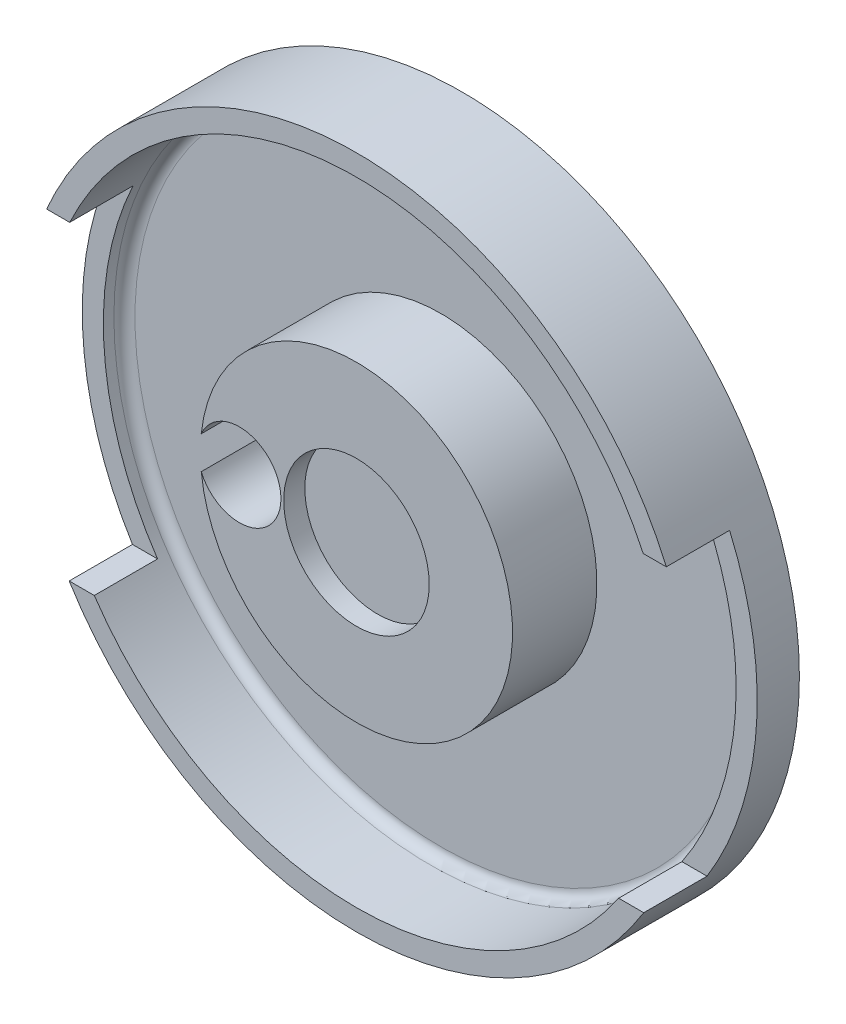
ISO-10303-21;
HEADER;
FILE_DESCRIPTION(('STEP AP214'),'2;1');
FILE_NAME('part.step','',(''),(''),'','','');
FILE_SCHEMA(('AUTOMOTIVE_DESIGN { 1 0 10303 214 1 1 1 1 }'));
ENDSEC;
DATA;
#1=APPLICATION_CONTEXT('core data for automotive mechanical design processes');
#2=APPLICATION_PROTOCOL_DEFINITION('international standard','automotive_design',2000,#1);
#3=PRODUCT_CONTEXT('',#1,'mechanical');
#4=PRODUCT('Part','Part','',(#3));
#5=PRODUCT_RELATED_PRODUCT_CATEGORY('part','',(#4));
#6=PRODUCT_DEFINITION_FORMATION('','',#4);
#7=PRODUCT_DEFINITION_CONTEXT('part definition',#1,'design');
#8=PRODUCT_DEFINITION('design','',#6,#7);
#9=PRODUCT_DEFINITION_SHAPE('','',#8);
#10=(LENGTH_UNIT() NAMED_UNIT(*) SI_UNIT(.MILLI.,.METRE.));
#11=(NAMED_UNIT(*) PLANE_ANGLE_UNIT() SI_UNIT($,.RADIAN.));
#12=(NAMED_UNIT(*) SI_UNIT($,.STERADIAN.) SOLID_ANGLE_UNIT());
#13=UNCERTAINTY_MEASURE_WITH_UNIT(LENGTH_MEASURE(1.E-05),#10,'distance_accuracy_value','');
#14=(GEOMETRIC_REPRESENTATION_CONTEXT(3) GLOBAL_UNCERTAINTY_ASSIGNED_CONTEXT((#13)) GLOBAL_UNIT_ASSIGNED_CONTEXT((#10,
#11,#12)) REPRESENTATION_CONTEXT('',''));
#15=CARTESIAN_POINT('',(0.,0.,0.));
#16=DIRECTION('',(0.,0.,1.));
#17=DIRECTION('',(1.,0.,0.));
#18=AXIS2_PLACEMENT_3D('',#15,#16,#17);
#19=CARTESIAN_POINT('',(0.,0.,5.));
#20=DIRECTION('',(0.,0.,1.));
#21=DIRECTION('',(1.,0.,0.));
#22=AXIS2_PLACEMENT_3D('',#19,#20,#21);
#23=PLANE('',#22);
#24=CARTESIAN_POINT('',(0.,0.,5.));
#25=DIRECTION('',(0.,0.,1.));
#26=DIRECTION('',(1.,0.,0.));
#27=AXIS2_PLACEMENT_3D('',#24,#25,#26);
#28=CIRCLE('',#27,16.);
#29=CARTESIAN_POINT('',(-13.6201960323075,-8.39584778575195,5.));
#30=VERTEX_POINT('',#29);
#31=CARTESIAN_POINT('',(13.6201960323075,-8.39584778575195,5.));
#32=VERTEX_POINT('',#31);
#33=EDGE_CURVE('E177',#30,#32,#28,.T.);
#34=ORIENTED_EDGE('',*,*,#33,.T.);
#35=DIRECTION('',(-1.,0.,0.));
#36=VECTOR('',#35,1.);
#37=CARTESIAN_POINT('',(0.,-8.39584778575195,5.));
#38=LINE('',#37,#36);
#39=CARTESIAN_POINT('',(12.4301946870708,-8.39584778575195,5.));
#40=VERTEX_POINT('',#39);
#41=EDGE_CURVE('E146',#32,#40,#38,.T.);
#42=ORIENTED_EDGE('',*,*,#41,.T.);
#43=CARTESIAN_POINT('',(0.,0.,5.));
#44=DIRECTION('',(0.,0.,1.));
#45=DIRECTION('',(1.,0.,0.));
#46=AXIS2_PLACEMENT_3D('',#43,#44,#45);
#47=CIRCLE('',#46,15.);
#48=CARTESIAN_POINT('',(-12.4301946870708,-8.39584778575195,5.));
#49=VERTEX_POINT('',#48);
#50=EDGE_CURVE('E174',#49,#40,#47,.T.);
#51=ORIENTED_EDGE('',*,*,#50,.F.);
#52=DIRECTION('',(1.,0.,0.));
#53=VECTOR('',#52,1.);
#54=CARTESIAN_POINT('',(0.,-8.39584778575195,5.));
#55=LINE('',#54,#53);
#56=EDGE_CURVE('E165',#30,#49,#55,.T.);
#57=ORIENTED_EDGE('',*,*,#56,.F.);
#58=EDGE_LOOP('',(#34,#42,#51,#57));
#59=FACE_BOUND('',#58,.T.);
#60=ADVANCED_FACE('F39',(#59),#23,.T.);
#61=CARTESIAN_POINT('',(0.,0.,5.));
#62=DIRECTION('',(0.,0.,-1.));
#63=DIRECTION('',(-1.,0.,0.));
#64=AXIS2_PLACEMENT_3D('',#61,#62,#63);
#65=CYLINDRICAL_SURFACE('',#64,16.);
#66=CARTESIAN_POINT('',(0.,0.,0.));
#67=DIRECTION('',(0.,0.,1.));
#68=DIRECTION('',(1.,0.,0.));
#69=AXIS2_PLACEMENT_3D('',#66,#67,#68);
#70=CIRCLE('',#69,16.);
#71=CARTESIAN_POINT('',(16.,0.,0.));
#72=VERTEX_POINT('',#71);
#73=EDGE_CURVE('E178',#72,#72,#70,.T.);
#74=ORIENTED_EDGE('',*,*,#73,.T.);
#75=EDGE_LOOP('',(#74));
#76=FACE_BOUND('',#75,.T.);
#77=CARTESIAN_POINT('',(14.6905696553376,6.33933460243845,5.));
#78=VERTEX_POINT('',#77);
#79=CARTESIAN_POINT('',(-14.6905696553376,6.33933460243845,5.));
#80=VERTEX_POINT('',#79);
#81=EDGE_CURVE('E182',#78,#80,#28,.T.);
#82=ORIENTED_EDGE('',*,*,#81,.F.);
#83=DIRECTION('',(0.,0.,-1.));
#84=VECTOR('',#83,1.);
#85=CARTESIAN_POINT('',(14.6905696553376,6.33933460243845,5.));
#86=LINE('',#85,#84);
#87=CARTESIAN_POINT('',(14.6905696553376,6.33933460243845,2.));
#88=VERTEX_POINT('',#87);
#89=EDGE_CURVE('E152',#78,#88,#86,.T.);
#90=ORIENTED_EDGE('',*,*,#89,.T.);
#91=CARTESIAN_POINT('',(0.,0.,2.));
#92=DIRECTION('',(0.,0.,-1.));
#93=DIRECTION('',(-1.,0.,0.));
#94=AXIS2_PLACEMENT_3D('',#91,#92,#93);
#95=CIRCLE('',#94,16.);
#96=CARTESIAN_POINT('',(13.6201960323075,-8.39584778575195,2.));
#97=VERTEX_POINT('',#96);
#98=EDGE_CURVE('E141',#88,#97,#95,.T.);
#99=ORIENTED_EDGE('',*,*,#98,.T.);
#100=DIRECTION('',(0.,0.,-1.));
#101=VECTOR('',#100,1.);
#102=CARTESIAN_POINT('',(13.6201960323075,-8.39584778575195,5.));
#103=LINE('',#102,#101);
#104=EDGE_CURVE('E148',#32,#97,#103,.T.);
#105=ORIENTED_EDGE('',*,*,#104,.F.);
#106=ORIENTED_EDGE('',*,*,#33,.F.);
#107=DIRECTION('',(0.,0.,-1.));
#108=VECTOR('',#107,1.);
#109=CARTESIAN_POINT('',(-13.6201960323075,-8.39584778575195,5.));
#110=LINE('',#109,#108);
#111=CARTESIAN_POINT('',(-13.6201960323075,-8.39584778575195,2.));
#112=VERTEX_POINT('',#111);
#113=EDGE_CURVE('E168',#30,#112,#110,.T.);
#114=ORIENTED_EDGE('',*,*,#113,.T.);
#115=CARTESIAN_POINT('',(0.,0.,2.));
#116=DIRECTION('',(0.,0.,-1.));
#117=DIRECTION('',(-1.,0.,0.));
#118=AXIS2_PLACEMENT_3D('',#115,#116,#117);
#119=CIRCLE('',#118,16.);
#120=CARTESIAN_POINT('',(-14.6905696553376,6.33933460243845,2.));
#121=VERTEX_POINT('',#120);
#122=EDGE_CURVE('E163',#112,#121,#119,.T.);
#123=ORIENTED_EDGE('',*,*,#122,.T.);
#124=DIRECTION('',(0.,0.,-1.));
#125=VECTOR('',#124,1.);
#126=CARTESIAN_POINT('',(-14.6905696553376,6.33933460243845,5.));
#127=LINE('',#126,#125);
#128=EDGE_CURVE('E175',#80,#121,#127,.T.);
#129=ORIENTED_EDGE('',*,*,#128,.F.);
#130=EDGE_LOOP('',(#82,#90,#99,#105,#106,#114,#123,#129));
#131=FACE_BOUND('',#130,.T.);
#132=ADVANCED_FACE('F224',(#76,#131),#65,.T.);
#133=DIRECTION('',(-1.,0.,0.));
#134=VECTOR('',#133,1.);
#135=CARTESIAN_POINT('',(0.,6.33933460243845,5.));
#136=LINE('',#135,#134);
#137=CARTESIAN_POINT('',(13.5945885115485,6.33933460243845,5.));
#138=VERTEX_POINT('',#137);
#139=EDGE_CURVE('E151',#78,#138,#136,.T.);
#140=ORIENTED_EDGE('',*,*,#139,.F.);
#141=ORIENTED_EDGE('',*,*,#81,.T.);
#142=DIRECTION('',(1.,0.,0.));
#143=VECTOR('',#142,1.);
#144=CARTESIAN_POINT('',(0.,6.33933460243845,5.));
#145=LINE('',#144,#143);
#146=CARTESIAN_POINT('',(-13.5945885115485,6.33933460243845,5.));
#147=VERTEX_POINT('',#146);
#148=EDGE_CURVE('E169',#80,#147,#145,.T.);
#149=ORIENTED_EDGE('',*,*,#148,.T.);
#150=EDGE_CURVE('E172',#138,#147,#47,.T.);
#151=ORIENTED_EDGE('',*,*,#150,.F.);
#152=EDGE_LOOP('',(#140,#141,#149,#151));
#153=FACE_BOUND('',#152,.T.);
#154=ADVANCED_FACE('F213',(#153),#23,.T.);
#155=CARTESIAN_POINT('',(0.,0.,1.));
#156=DIRECTION('',(0.,0.,1.));
#157=DIRECTION('',(1.,0.,0.));
#158=AXIS2_PLACEMENT_3D('',#155,#156,#157);
#159=CYLINDRICAL_SURFACE('',#158,15.);
#160=CARTESIAN_POINT('',(0.,0.,2.));
#161=DIRECTION('',(0.,0.,-1.));
#162=DIRECTION('',(-1.,0.,0.));
#163=AXIS2_PLACEMENT_3D('',#160,#161,#162);
#164=CIRCLE('',#163,15.);
#165=CARTESIAN_POINT('',(12.4301946870708,-8.39584778575195,2.));
#166=VERTEX_POINT('',#165);
#167=CARTESIAN_POINT('',(13.5945885115485,6.33933460243845,2.));
#168=VERTEX_POINT('',#167);
#169=EDGE_CURVE('E199',#166,#168,#164,.F.);
#170=ORIENTED_EDGE('',*,*,#169,.T.);
#171=DIRECTION('',(0.,0.,1.));
#172=VECTOR('',#171,1.);
#173=CARTESIAN_POINT('',(13.5945885115485,6.33933460243845,1.));
#174=LINE('',#173,#172);
#175=EDGE_CURVE('E43',#168,#138,#174,.T.);
#176=ORIENTED_EDGE('',*,*,#175,.T.);
#177=ORIENTED_EDGE('',*,*,#150,.T.);
#178=DIRECTION('',(0.,0.,1.));
#179=VECTOR('',#178,1.);
#180=CARTESIAN_POINT('',(-13.5945885115485,6.33933460243845,1.));
#181=LINE('',#180,#179);
#182=CARTESIAN_POINT('',(-13.5945885115485,6.33933460243845,2.));
#183=VERTEX_POINT('',#182);
#184=EDGE_CURVE('E200',#183,#147,#181,.T.);
#185=ORIENTED_EDGE('',*,*,#184,.F.);
#186=CARTESIAN_POINT('',(0.,0.,2.));
#187=DIRECTION('',(0.,0.,-1.));
#188=DIRECTION('',(-1.,0.,0.));
#189=AXIS2_PLACEMENT_3D('',#186,#187,#188);
#190=CIRCLE('',#189,15.);
#191=CARTESIAN_POINT('',(-12.4301946870708,-8.39584778575195,2.));
#192=VERTEX_POINT('',#191);
#193=EDGE_CURVE('E191',#183,#192,#190,.F.);
#194=ORIENTED_EDGE('',*,*,#193,.T.);
#195=DIRECTION('',(0.,0.,1.));
#196=VECTOR('',#195,1.);
#197=CARTESIAN_POINT('',(-12.4301946870708,-8.39584778575195,1.));
#198=LINE('',#197,#196);
#199=EDGE_CURVE('E193',#192,#49,#198,.T.);
#200=ORIENTED_EDGE('',*,*,#199,.T.);
#201=ORIENTED_EDGE('',*,*,#50,.T.);
#202=DIRECTION('',(0.,0.,1.));
#203=VECTOR('',#202,1.);
#204=CARTESIAN_POINT('',(12.4301946870708,-8.39584778575195,1.));
#205=LINE('',#204,#203);
#206=EDGE_CURVE('E204',#166,#40,#205,.T.);
#207=ORIENTED_EDGE('',*,*,#206,.F.);
#208=EDGE_LOOP('',(#170,#176,#177,#185,#194,#200,#201,#207));
#209=FACE_BOUND('',#208,.T.);
#210=CARTESIAN_POINT('',(0.,0.,1.5));
#211=DIRECTION('',(0.,0.,1.));
#212=DIRECTION('',(1.,0.,0.));
#213=AXIS2_PLACEMENT_3D('',#210,#211,#212);
#214=CIRCLE('',#213,15.);
#215=CARTESIAN_POINT('',(15.,0.,1.5));
#216=VERTEX_POINT('',#215);
#217=EDGE_CURVE('E189',#216,#216,#214,.F.);
#218=ORIENTED_EDGE('',*,*,#217,.T.);
#219=EDGE_LOOP('',(#218));
#220=FACE_BOUND('',#219,.T.);
#221=ADVANCED_FACE('F206',(#209,#220),#159,.F.);
#222=CARTESIAN_POINT('',(0.,0.,0.));
#223=DIRECTION('',(0.,0.,1.));
#224=DIRECTION('',(1.,0.,0.));
#225=AXIS2_PLACEMENT_3D('',#222,#223,#224);
#226=PLANE('',#225);
#227=CARTESIAN_POINT('',(-5.54966081388172,0.,0.));
#228=DIRECTION('',(0.,0.,1.));
#229=DIRECTION('',(1.,0.,0.));
#230=AXIS2_PLACEMENT_3D('',#227,#228,#229);
#231=CIRCLE('',#230,1.96944750254763);
#232=CARTESIAN_POINT('',(-3.5802133113341,0.,0.));
#233=VERTEX_POINT('',#232);
#234=EDGE_CURVE('E127',#233,#233,#231,.T.);
#235=ORIENTED_EDGE('',*,*,#234,.T.);
#236=EDGE_LOOP('',(#235));
#237=FACE_BOUND('',#236,.T.);
#238=ORIENTED_EDGE('',*,*,#73,.F.);
#239=EDGE_LOOP('',(#238));
#240=FACE_BOUND('',#239,.T.);
#241=ADVANCED_FACE('F257',(#237,#240),#226,.F.);
#242=CARTESIAN_POINT('',(0.,0.,1.));
#243=DIRECTION('',(0.,0.,1.));
#244=DIRECTION('',(1.,0.,0.));
#245=AXIS2_PLACEMENT_3D('',#242,#243,#244);
#246=PLANE('',#245);
#247=CARTESIAN_POINT('',(-5.54966081388172,0.,1.));
#248=DIRECTION('',(0.,0.,1.));
#249=DIRECTION('',(1.,0.,0.));
#250=AXIS2_PLACEMENT_3D('',#247,#248,#249);
#251=CIRCLE('',#250,1.96944750254763);
#252=CARTESIAN_POINT('',(-7.35900935418718,0.777805454458639,1.));
#253=VERTEX_POINT('',#252);
#254=CARTESIAN_POINT('',(-7.35900935418718,-0.777805454458644,1.));
#255=VERTEX_POINT('',#254);
#256=EDGE_CURVE('E54',#253,#255,#251,.T.);
#257=ORIENTED_EDGE('',*,*,#256,.F.);
#258=CARTESIAN_POINT('',(0.,0.,1.));
#259=DIRECTION('',(0.,0.,1.));
#260=DIRECTION('',(1.,0.,0.));
#261=AXIS2_PLACEMENT_3D('',#258,#259,#260);
#262=CIRCLE('',#261,7.4);
#263=EDGE_CURVE('E130',#255,#253,#262,.T.);
#264=ORIENTED_EDGE('',*,*,#263,.F.);
#265=EDGE_LOOP('',(#257,#264));
#266=FACE_BOUND('',#265,.T.);
#267=CARTESIAN_POINT('',(0.,0.,1.));
#268=DIRECTION('',(0.,0.,1.));
#269=DIRECTION('',(1.,0.,0.));
#270=AXIS2_PLACEMENT_3D('',#267,#268,#269);
#271=CIRCLE('',#270,14.5);
#272=CARTESIAN_POINT('',(14.5,0.,1.));
#273=VERTEX_POINT('',#272);
#274=EDGE_CURVE('E185',#273,#273,#271,.T.);
#275=ORIENTED_EDGE('',*,*,#274,.T.);
#276=EDGE_LOOP('',(#275));
#277=FACE_BOUND('',#276,.T.);
#278=ADVANCED_FACE('F265',(#266,#277),#246,.T.);
#279=CARTESIAN_POINT('',(0.,0.,1.5));
#280=DIRECTION('',(0.,0.,1.));
#281=DIRECTION('',(1.,0.,0.));
#282=AXIS2_PLACEMENT_3D('',#279,#280,#281);
#283=TOROIDAL_SURFACE('',#282,14.5,0.5);
#284=ORIENTED_EDGE('',*,*,#217,.F.);
#285=EDGE_LOOP('',(#284));
#286=FACE_BOUND('',#285,.T.);
#287=ORIENTED_EDGE('',*,*,#274,.F.);
#288=EDGE_LOOP('',(#287));
#289=FACE_BOUND('',#288,.T.);
#290=ADVANCED_FACE('F41',(#286,#289),#283,.F.);
#291=CARTESIAN_POINT('',(-17.0905034214387,6.33933460243845,2.));
#292=DIRECTION('',(0.,-1.,0.));
#293=DIRECTION('',(0.,0.,-1.));
#294=AXIS2_PLACEMENT_3D('',#291,#292,#293);
#295=PLANE('',#294);
#296=ORIENTED_EDGE('',*,*,#128,.T.);
#297=DIRECTION('',(1.,0.,0.));
#298=VECTOR('',#297,1.);
#299=CARTESIAN_POINT('',(-17.0905034214387,6.33933460243845,2.));
#300=LINE('',#299,#298);
#301=EDGE_CURVE('E158',#121,#183,#300,.T.);
#302=ORIENTED_EDGE('',*,*,#301,.T.);
#303=ORIENTED_EDGE('',*,*,#184,.T.);
#304=ORIENTED_EDGE('',*,*,#148,.F.);
#305=EDGE_LOOP('',(#296,#302,#303,#304));
#306=FACE_BOUND('',#305,.T.);
#307=ADVANCED_FACE('F218',(#306),#295,.T.);
#308=CARTESIAN_POINT('',(-17.0905034214387,-8.39584778575195,2.));
#309=DIRECTION('',(0.,-1.,0.));
#310=DIRECTION('',(0.,0.,-1.));
#311=AXIS2_PLACEMENT_3D('',#308,#309,#310);
#312=PLANE('',#311);
#313=ORIENTED_EDGE('',*,*,#56,.T.);
#314=ORIENTED_EDGE('',*,*,#199,.F.);
#315=DIRECTION('',(1.,0.,0.));
#316=VECTOR('',#315,1.);
#317=CARTESIAN_POINT('',(-17.0905034214387,-8.39584778575195,2.));
#318=LINE('',#317,#316);
#319=EDGE_CURVE('E160',#112,#192,#318,.T.);
#320=ORIENTED_EDGE('',*,*,#319,.F.);
#321=ORIENTED_EDGE('',*,*,#113,.F.);
#322=EDGE_LOOP('',(#313,#314,#320,#321));
#323=FACE_BOUND('',#322,.T.);
#324=ADVANCED_FACE('F230',(#323),#312,.F.);
#325=CARTESIAN_POINT('',(0.,0.,2.));
#326=DIRECTION('',(0.,0.,-1.));
#327=DIRECTION('',(-1.,0.,0.));
#328=AXIS2_PLACEMENT_3D('',#325,#326,#327);
#329=PLANE('',#328);
#330=ORIENTED_EDGE('',*,*,#319,.T.);
#331=ORIENTED_EDGE('',*,*,#193,.F.);
#332=ORIENTED_EDGE('',*,*,#301,.F.);
#333=ORIENTED_EDGE('',*,*,#122,.F.);
#334=EDGE_LOOP('',(#330,#331,#332,#333));
#335=FACE_BOUND('',#334,.T.);
#336=ADVANCED_FACE('F228',(#335),#329,.F.);
#337=CARTESIAN_POINT('',(17.0905034214387,6.33933460243845,2.));
#338=DIRECTION('',(0.,1.,0.));
#339=DIRECTION('',(0.,0.,1.));
#340=AXIS2_PLACEMENT_3D('',#337,#338,#339);
#341=PLANE('',#340);
#342=ORIENTED_EDGE('',*,*,#139,.T.);
#343=ORIENTED_EDGE('',*,*,#175,.F.);
#344=DIRECTION('',(-1.,0.,0.));
#345=VECTOR('',#344,1.);
#346=CARTESIAN_POINT('',(17.0905034214387,6.33933460243845,2.));
#347=LINE('',#346,#345);
#348=EDGE_CURVE('E62',#88,#168,#347,.T.);
#349=ORIENTED_EDGE('',*,*,#348,.F.);
#350=ORIENTED_EDGE('',*,*,#89,.F.);
#351=EDGE_LOOP('',(#342,#343,#349,#350));
#352=FACE_BOUND('',#351,.T.);
#353=ADVANCED_FACE('F240',(#352),#341,.F.);
#354=CARTESIAN_POINT('',(17.0905034214387,-8.39584778575195,2.));
#355=DIRECTION('',(0.,1.,0.));
#356=DIRECTION('',(0.,0.,1.));
#357=AXIS2_PLACEMENT_3D('',#354,#355,#356);
#358=PLANE('',#357);
#359=ORIENTED_EDGE('',*,*,#104,.T.);
#360=DIRECTION('',(-1.,0.,0.));
#361=VECTOR('',#360,1.);
#362=CARTESIAN_POINT('',(17.0905034214387,-8.39584778575195,2.));
#363=LINE('',#362,#361);
#364=EDGE_CURVE('E132',#97,#166,#363,.T.);
#365=ORIENTED_EDGE('',*,*,#364,.T.);
#366=ORIENTED_EDGE('',*,*,#206,.T.);
#367=ORIENTED_EDGE('',*,*,#41,.F.);
#368=EDGE_LOOP('',(#359,#365,#366,#367));
#369=FACE_BOUND('',#368,.T.);
#370=ADVANCED_FACE('F234',(#369),#358,.T.);
#371=CARTESIAN_POINT('',(0.,0.,2.));
#372=DIRECTION('',(0.,0.,-1.));
#373=DIRECTION('',(1.,0.,0.));
#374=AXIS2_PLACEMENT_3D('',#371,#372,#373);
#375=PLANE('',#374);
#376=ORIENTED_EDGE('',*,*,#348,.T.);
#377=ORIENTED_EDGE('',*,*,#169,.F.);
#378=ORIENTED_EDGE('',*,*,#364,.F.);
#379=ORIENTED_EDGE('',*,*,#98,.F.);
#380=EDGE_LOOP('',(#376,#377,#378,#379));
#381=FACE_BOUND('',#380,.T.);
#382=ADVANCED_FACE('F236',(#381),#375,.F.);
#383=CARTESIAN_POINT('',(0.,0.,5.));
#384=DIRECTION('',(0.,0.,-1.));
#385=DIRECTION('',(-1.,0.,0.));
#386=AXIS2_PLACEMENT_3D('',#383,#384,#385);
#387=CYLINDRICAL_SURFACE('',#386,7.4);
#388=ORIENTED_EDGE('',*,*,#263,.T.);
#389=DIRECTION('',(0.,0.,1.));
#390=VECTOR('',#389,1.);
#391=CARTESIAN_POINT('',(-7.35900935418718,0.777805454458639,0.));
#392=LINE('',#391,#390);
#393=CARTESIAN_POINT('',(-7.35900935418718,0.777805454458639,5.));
#394=VERTEX_POINT('',#393);
#395=EDGE_CURVE('E120',#253,#394,#392,.T.);
#396=ORIENTED_EDGE('',*,*,#395,.T.);
#397=CARTESIAN_POINT('',(0.,0.,5.));
#398=DIRECTION('',(0.,0.,1.));
#399=DIRECTION('',(1.,0.,0.));
#400=AXIS2_PLACEMENT_3D('',#397,#398,#399);
#401=CIRCLE('',#400,7.4);
#402=CARTESIAN_POINT('',(-7.35900935418718,-0.777805454458639,5.));
#403=VERTEX_POINT('',#402);
#404=EDGE_CURVE('E123',#403,#394,#401,.T.);
#405=ORIENTED_EDGE('',*,*,#404,.F.);
#406=DIRECTION('',(0.,0.,1.));
#407=VECTOR('',#406,1.);
#408=CARTESIAN_POINT('',(-7.35900935418718,-0.777805454458639,0.));
#409=LINE('',#408,#407);
#410=EDGE_CURVE('E117',#403,#255,#409,.F.);
#411=ORIENTED_EDGE('',*,*,#410,.T.);
#412=EDGE_LOOP('',(#388,#396,#405,#411));
#413=FACE_BOUND('',#412,.T.);
#414=ADVANCED_FACE('F121',(#413),#387,.T.);
#415=CARTESIAN_POINT('',(0.,0.,5.));
#416=DIRECTION('',(0.,0.,1.));
#417=DIRECTION('',(1.,0.,0.));
#418=AXIS2_PLACEMENT_3D('',#415,#416,#417);
#419=PLANE('',#418);
#420=CARTESIAN_POINT('',(-5.54966081388172,0.,5.));
#421=DIRECTION('',(0.,0.,1.));
#422=DIRECTION('',(1.,0.,0.));
#423=AXIS2_PLACEMENT_3D('',#420,#421,#422);
#424=CIRCLE('',#423,1.96944750254763);
#425=EDGE_CURVE('E11',#403,#394,#424,.T.);
#426=ORIENTED_EDGE('',*,*,#425,.F.);
#427=ORIENTED_EDGE('',*,*,#404,.T.);
#428=EDGE_LOOP('',(#426,#427));
#429=FACE_BOUND('',#428,.T.);
#430=CARTESIAN_POINT('',(0.,0.,5.));
#431=DIRECTION('',(0.,0.,1.));
#432=DIRECTION('',(1.,0.,0.));
#433=AXIS2_PLACEMENT_3D('',#430,#431,#432);
#434=CIRCLE('',#433,3.45);
#435=CARTESIAN_POINT('',(3.45,0.,5.));
#436=VERTEX_POINT('',#435);
#437=EDGE_CURVE('E137',#436,#436,#434,.T.);
#438=ORIENTED_EDGE('',*,*,#437,.F.);
#439=EDGE_LOOP('',(#438));
#440=FACE_BOUND('',#439,.T.);
#441=ADVANCED_FACE('F129',(#429,#440),#419,.T.);
#442=CARTESIAN_POINT('',(0.,0.,4.));
#443=DIRECTION('',(0.,0.,1.));
#444=DIRECTION('',(1.,0.,0.));
#445=AXIS2_PLACEMENT_3D('',#442,#443,#444);
#446=CYLINDRICAL_SURFACE('',#445,3.45);
#447=CARTESIAN_POINT('',(0.,0.,4.));
#448=DIRECTION('',(0.,0.,1.));
#449=DIRECTION('',(1.,0.,0.));
#450=AXIS2_PLACEMENT_3D('',#447,#448,#449);
#451=CIRCLE('',#450,3.45);
#452=CARTESIAN_POINT('',(3.45,0.,4.));
#453=VERTEX_POINT('',#452);
#454=EDGE_CURVE('E134',#453,#453,#451,.T.);
#455=ORIENTED_EDGE('',*,*,#454,.F.);
#456=EDGE_LOOP('',(#455));
#457=FACE_BOUND('',#456,.T.);
#458=ORIENTED_EDGE('',*,*,#437,.T.);
#459=EDGE_LOOP('',(#458));
#460=FACE_BOUND('',#459,.T.);
#461=ADVANCED_FACE('F325',(#457,#460),#446,.F.);
#462=CARTESIAN_POINT('',(0.,0.,4.));
#463=DIRECTION('',(0.,0.,1.));
#464=DIRECTION('',(1.,0.,0.));
#465=AXIS2_PLACEMENT_3D('',#462,#463,#464);
#466=PLANE('',#465);
#467=ORIENTED_EDGE('',*,*,#454,.T.);
#468=EDGE_LOOP('',(#467));
#469=FACE_BOUND('',#468,.T.);
#470=ADVANCED_FACE('F333',(#469),#466,.T.);
#471=CARTESIAN_POINT('',(-5.54966081388172,0.,-5.));
#472=DIRECTION('',(0.,0.,1.));
#473=DIRECTION('',(1.,0.,0.));
#474=AXIS2_PLACEMENT_3D('',#471,#472,#473);
#475=CYLINDRICAL_SURFACE('',#474,1.96944750254763);
#476=ORIENTED_EDGE('',*,*,#256,.T.);
#477=ORIENTED_EDGE('',*,*,#410,.F.);
#478=ORIENTED_EDGE('',*,*,#425,.T.);
#479=ORIENTED_EDGE('',*,*,#395,.F.);
#480=EDGE_LOOP('',(#476,#477,#478,#479));
#481=FACE_BOUND('',#480,.T.);
#482=ORIENTED_EDGE('',*,*,#234,.F.);
#483=EDGE_LOOP('',(#482));
#484=FACE_BOUND('',#483,.T.);
#485=ADVANCED_FACE('F114',(#481,#484),#475,.F.);
#486=CLOSED_SHELL('',(#60,#132,#154,#221,#241,#278,#290,#307,#324,#336,#353,#370,#382,#414,#441,
#461,#470,#485));
#487=MANIFOLD_SOLID_BREP('B2',#486);
#488=ADVANCED_BREP_SHAPE_REPRESENTATION('',(#18,#487),#14);
#489=SHAPE_DEFINITION_REPRESENTATION(#9,#488);
ENDSEC;
END-ISO-10303-21;
